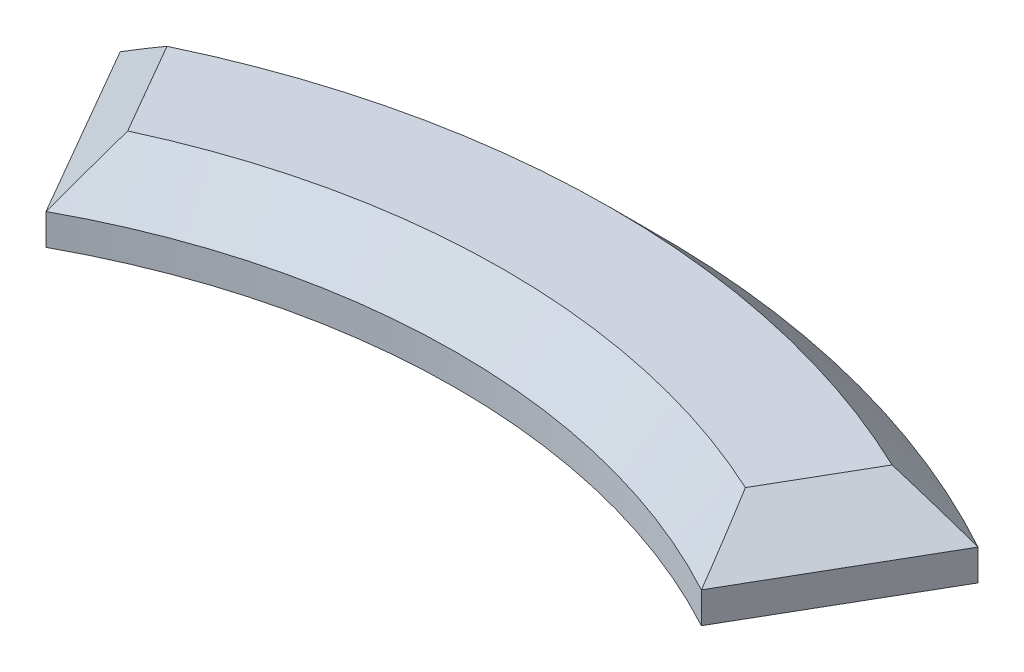
ISO-10303-21;
HEADER;
FILE_DESCRIPTION(('STEP AP214'),'2;1');
FILE_NAME('part.step','',(''),(''),'','','');
FILE_SCHEMA(('AUTOMOTIVE_DESIGN { 1 0 10303 214 1 1 1 1 }'));
ENDSEC;
DATA;
#1=APPLICATION_CONTEXT('core data for automotive mechanical design processes');
#2=APPLICATION_PROTOCOL_DEFINITION('international standard','automotive_design',2000,#1);
#3=PRODUCT_CONTEXT('',#1,'mechanical');
#4=PRODUCT('Part','Part','',(#3));
#5=PRODUCT_RELATED_PRODUCT_CATEGORY('part','',(#4));
#6=PRODUCT_DEFINITION_FORMATION('','',#4);
#7=PRODUCT_DEFINITION_CONTEXT('part definition',#1,'design');
#8=PRODUCT_DEFINITION('design','',#6,#7);
#9=PRODUCT_DEFINITION_SHAPE('','',#8);
#10=(LENGTH_UNIT() NAMED_UNIT(*) SI_UNIT(.MILLI.,.METRE.));
#11=(NAMED_UNIT(*) PLANE_ANGLE_UNIT() SI_UNIT($,.RADIAN.));
#12=(NAMED_UNIT(*) SI_UNIT($,.STERADIAN.) SOLID_ANGLE_UNIT());
#13=UNCERTAINTY_MEASURE_WITH_UNIT(LENGTH_MEASURE(1.E-05),#10,'distance_accuracy_value','');
#14=(GEOMETRIC_REPRESENTATION_CONTEXT(3) GLOBAL_UNCERTAINTY_ASSIGNED_CONTEXT((#13)) GLOBAL_UNIT_ASSIGNED_CONTEXT((#10,
#11,#12)) REPRESENTATION_CONTEXT('',''));
#15=CARTESIAN_POINT('',(0.,0.,0.));
#16=DIRECTION('',(0.,0.,1.));
#17=DIRECTION('',(1.,0.,0.));
#18=AXIS2_PLACEMENT_3D('',#15,#16,#17);
#19=CARTESIAN_POINT('',(0.,3.3,0.));
#20=DIRECTION('',(0.,-1.,0.));
#21=DIRECTION('',(0.,0.,-1.));
#22=AXIS2_PLACEMENT_3D('',#19,#20,#21);
#23=CYLINDRICAL_SURFACE('',#22,37.25);
#24=DIRECTION('',(0.,-1.,0.));
#25=VECTOR('',#24,1.);
#26=CARTESIAN_POINT('',(-17.9717053966979,3.3,-32.6279068457402));
#27=LINE('',#26,#25);
#28=CARTESIAN_POINT('',(-17.9717053966979,1.29999999999999,-32.6279068457402));
#29=VERTEX_POINT('',#28);
#30=CARTESIAN_POINT('',(-17.9717053966979,0.,-32.6279068457402));
#31=VERTEX_POINT('',#30);
#32=EDGE_CURVE('E96',#29,#31,#27,.T.);
#33=ORIENTED_EDGE('',*,*,#32,.F.);
#34=CARTESIAN_POINT('',(0.,1.29999999999999,0.));
#35=DIRECTION('',(0.,-1.,0.));
#36=DIRECTION('',(0.,0.,-1.));
#37=AXIS2_PLACEMENT_3D('',#34,#35,#36);
#38=CIRCLE('',#37,37.25);
#39=CARTESIAN_POINT('',(17.9717053966978,1.29999999999999,-32.6279068457403));
#40=VERTEX_POINT('',#39);
#41=EDGE_CURVE('E143',#29,#40,#38,.T.);
#42=ORIENTED_EDGE('',*,*,#41,.T.);
#43=DIRECTION('',(0.,-1.,0.));
#44=VECTOR('',#43,1.);
#45=CARTESIAN_POINT('',(17.9717053966978,3.3,-32.6279068457403));
#46=LINE('',#45,#44);
#47=CARTESIAN_POINT('',(17.9717053966978,0.,-32.6279068457403));
#48=VERTEX_POINT('',#47);
#49=EDGE_CURVE('E116',#40,#48,#46,.T.);
#50=ORIENTED_EDGE('',*,*,#49,.T.);
#51=CARTESIAN_POINT('',(0.,0.,0.));
#52=DIRECTION('',(0.,1.,0.));
#53=DIRECTION('',(0.,0.,-1.));
#54=AXIS2_PLACEMENT_3D('',#51,#52,#53);
#55=CIRCLE('',#54,37.25);
#56=EDGE_CURVE('E111',#48,#31,#55,.T.);
#57=ORIENTED_EDGE('',*,*,#56,.T.);
#58=EDGE_LOOP('',(#33,#42,#50,#57));
#59=FACE_BOUND('',#58,.T.);
#60=ADVANCED_FACE('F39',(#59),#23,.T.);
#61=CARTESIAN_POINT('',(-17.9717053966979,3.3,-32.6279068457402));
#62=DIRECTION('',(0.866025403784436,0.,-0.500000000000004));
#63=DIRECTION('',(-0.500000000000004,0.,-0.866025403784436));
#64=AXIS2_PLACEMENT_3D('',#61,#62,#63);
#65=PLANE('',#64);
#66=DIRECTION('',(0.,-1.,0.));
#67=VECTOR('',#66,1.);
#68=CARTESIAN_POINT('',(-13.7292564976257,3.3,-25.2797698040326));
#69=LINE('',#68,#67);
#70=CARTESIAN_POINT('',(-13.7292564976257,1.29999999999999,-25.2797698040326));
#71=VERTEX_POINT('',#70);
#72=CARTESIAN_POINT('',(-13.7292564976257,0.,-25.2797698040326));
#73=VERTEX_POINT('',#72);
#74=EDGE_CURVE('E105',#71,#73,#69,.T.);
#75=ORIENTED_EDGE('',*,*,#74,.F.);
#76=DIRECTION('',(-0.500000000000004,0.,-0.866025403784436));
#77=VECTOR('',#76,1.);
#78=CARTESIAN_POINT('',(-17.9717053966979,1.29999999999999,-32.6279068457402));
#79=LINE('',#78,#77);
#80=EDGE_CURVE('E11',#71,#29,#79,.T.);
#81=ORIENTED_EDGE('',*,*,#80,.T.);
#82=ORIENTED_EDGE('',*,*,#32,.T.);
#83=DIRECTION('',(0.500000000000004,0.,0.866025403784436));
#84=VECTOR('',#83,1.);
#85=CARTESIAN_POINT('',(-17.9717053966979,0.,-32.6279068457402));
#86=LINE('',#85,#84);
#87=EDGE_CURVE('E99',#31,#73,#86,.T.);
#88=ORIENTED_EDGE('',*,*,#87,.T.);
#89=EDGE_LOOP('',(#75,#81,#82,#88));
#90=FACE_BOUND('',#89,.T.);
#91=ADVANCED_FACE('F98',(#90),#65,.F.);
#92=CARTESIAN_POINT('',(0.,3.3,0.));
#93=DIRECTION('',(0.,-1.,0.));
#94=DIRECTION('',(0.,0.,-1.));
#95=AXIS2_PLACEMENT_3D('',#92,#93,#94);
#96=CYLINDRICAL_SURFACE('',#95,28.7673294784635);
#97=DIRECTION('',(0.,-1.,0.));
#98=VECTOR('',#97,1.);
#99=CARTESIAN_POINT('',(13.7292564976256,3.3,-25.2797698040326));
#100=LINE('',#99,#98);
#101=CARTESIAN_POINT('',(13.7292564976256,1.29999999999999,-25.2797698040326));
#102=VERTEX_POINT('',#101);
#103=CARTESIAN_POINT('',(13.7292564976256,0.,-25.2797698040326));
#104=VERTEX_POINT('',#103);
#105=EDGE_CURVE('E129',#102,#104,#100,.T.);
#106=ORIENTED_EDGE('',*,*,#105,.F.);
#107=CARTESIAN_POINT('',(0.,1.29999999999999,0.));
#108=DIRECTION('',(0.,-1.,0.));
#109=DIRECTION('',(0.,0.,-1.));
#110=AXIS2_PLACEMENT_3D('',#107,#108,#109);
#111=CIRCLE('',#110,28.7673294784635);
#112=EDGE_CURVE('E54',#102,#71,#111,.F.);
#113=ORIENTED_EDGE('',*,*,#112,.T.);
#114=ORIENTED_EDGE('',*,*,#74,.T.);
#115=CARTESIAN_POINT('',(0.,0.,0.));
#116=DIRECTION('',(0.,-1.,0.));
#117=DIRECTION('',(0.,0.,-1.));
#118=AXIS2_PLACEMENT_3D('',#115,#116,#117);
#119=CIRCLE('',#118,28.7673294784635);
#120=EDGE_CURVE('E113',#73,#104,#119,.T.);
#121=ORIENTED_EDGE('',*,*,#120,.T.);
#122=EDGE_LOOP('',(#106,#113,#114,#121));
#123=FACE_BOUND('',#122,.T.);
#124=ADVANCED_FACE('F191',(#123),#96,.F.);
#125=CARTESIAN_POINT('',(17.9717053966978,3.3,-32.6279068457403));
#126=DIRECTION('',(-0.866025403784441,0.,-0.499999999999996));
#127=DIRECTION('',(-0.499999999999996,0.,0.866025403784441));
#128=AXIS2_PLACEMENT_3D('',#125,#126,#127);
#129=PLANE('',#128);
#130=ORIENTED_EDGE('',*,*,#49,.F.);
#131=DIRECTION('',(-0.499999999999996,0.,0.866025403784441));
#132=VECTOR('',#131,1.);
#133=CARTESIAN_POINT('',(17.9717053966978,1.29999999999998,-32.6279068457403));
#134=LINE('',#133,#132);
#135=EDGE_CURVE('E140',#40,#102,#134,.T.);
#136=ORIENTED_EDGE('',*,*,#135,.T.);
#137=ORIENTED_EDGE('',*,*,#105,.T.);
#138=DIRECTION('',(0.499999999999996,0.,-0.866025403784441));
#139=VECTOR('',#138,1.);
#140=CARTESIAN_POINT('',(17.9717053966978,0.,-32.6279068457403));
#141=LINE('',#140,#139);
#142=EDGE_CURVE('E126',#104,#48,#141,.T.);
#143=ORIENTED_EDGE('',*,*,#142,.T.);
#144=EDGE_LOOP('',(#130,#136,#137,#143));
#145=FACE_BOUND('',#144,.T.);
#146=ADVANCED_FACE('F196',(#145),#129,.F.);
#147=CARTESIAN_POINT('',(0.,3.3,0.));
#148=DIRECTION('',(0.,-1.,0.));
#149=DIRECTION('',(0.,0.,-1.));
#150=AXIS2_PLACEMENT_3D('',#147,#148,#149);
#151=PLANE('',#150);
#152=CARTESIAN_POINT('',(0.,3.3,0.));
#153=DIRECTION('',(0.,-1.,0.));
#154=DIRECTION('',(0.,0.,-1.));
#155=AXIS2_PLACEMENT_3D('',#152,#153,#154);
#156=CIRCLE('',#155,30.7673294784635);
#157=CARTESIAN_POINT('',(-12.9405225492177,3.3,-27.9136425317356));
#158=VERTEX_POINT('',#157);
#159=CARTESIAN_POINT('',(12.9405225492177,3.3,-27.9136425317356));
#160=VERTEX_POINT('',#159);
#161=EDGE_CURVE('E133',#158,#160,#156,.T.);
#162=ORIENTED_EDGE('',*,*,#161,.T.);
#163=DIRECTION('',(0.499999999999996,0.,-0.866025403784441));
#164=VECTOR('',#163,1.);
#165=CARTESIAN_POINT('',(-2.38156986040703,3.3,-1.37499999999988));
#166=LINE('',#165,#164);
#167=CARTESIAN_POINT('',(15.1897135303984,3.3,-31.8093555870664));
#168=VERTEX_POINT('',#167);
#169=EDGE_CURVE('E137',#160,#168,#166,.T.);
#170=ORIENTED_EDGE('',*,*,#169,.T.);
#171=CARTESIAN_POINT('',(0.,3.3,0.));
#172=DIRECTION('',(0.,-1.,0.));
#173=DIRECTION('',(0.,0.,-1.));
#174=AXIS2_PLACEMENT_3D('',#171,#172,#173);
#175=CIRCLE('',#174,35.25);
#176=CARTESIAN_POINT('',(-15.1897135303985,3.3,-31.8093555870663));
#177=VERTEX_POINT('',#176);
#178=EDGE_CURVE('E135',#168,#177,#175,.F.);
#179=ORIENTED_EDGE('',*,*,#178,.T.);
#180=DIRECTION('',(0.500000000000004,0.,0.866025403784436));
#181=VECTOR('',#180,1.);
#182=CARTESIAN_POINT('',(2.38156986040721,3.3,-1.37500000000002));
#183=LINE('',#182,#181);
#184=EDGE_CURVE('E104',#177,#158,#183,.T.);
#185=ORIENTED_EDGE('',*,*,#184,.T.);
#186=EDGE_LOOP('',(#162,#170,#179,#185));
#187=FACE_BOUND('',#186,.T.);
#188=ADVANCED_FACE('F199',(#187),#151,.F.);
#189=CARTESIAN_POINT('',(0.,0.,0.));
#190=DIRECTION('',(0.,-1.,0.));
#191=DIRECTION('',(0.,0.,-1.));
#192=AXIS2_PLACEMENT_3D('',#189,#190,#191);
#193=PLANE('',#192);
#194=CARTESIAN_POINT('',(0.,0.,-33.0086647392318));
#195=DIRECTION('',(0.,-1.,0.));
#196=DIRECTION('',(0.,0.,-1.));
#197=AXIS2_PLACEMENT_3D('',#194,#195,#196);
#198=CIRCLE('',#197,1.625);
#199=CARTESIAN_POINT('',(0.,0.,-34.6336647392318));
#200=VERTEX_POINT('',#199);
#201=EDGE_CURVE('E122',#200,#200,#198,.T.);
#202=ORIENTED_EDGE('',*,*,#201,.F.);
#203=EDGE_LOOP('',(#202));
#204=FACE_BOUND('',#203,.T.);
#205=ORIENTED_EDGE('',*,*,#56,.F.);
#206=ORIENTED_EDGE('',*,*,#142,.F.);
#207=ORIENTED_EDGE('',*,*,#120,.F.);
#208=ORIENTED_EDGE('',*,*,#87,.F.);
#209=EDGE_LOOP('',(#205,#206,#207,#208));
#210=FACE_BOUND('',#209,.T.);
#211=ADVANCED_FACE('F109',(#204,#210),#193,.T.);
#212=CARTESIAN_POINT('',(2.38156986040721,3.3,-1.37500000000001));
#213=DIRECTION('',(0.612372435695794,-0.707106781186546,-0.353553390593277));
#214=DIRECTION('',(0.500000000000004,0.,0.866025403784436));
#215=AXIS2_PLACEMENT_3D('',#212,#213,#214);
#216=PLANE('',#215);
#217=CARTESIAN_POINT('',(-15.1897135303985,3.3,-31.8093555870663));
#218=CARTESIAN_POINT('',(-15.4216878938742,3.13509072973067,-31.8813284301211));
#219=CARTESIAN_POINT('',(-15.6536347059954,2.96971899291436,-31.9523286197359));
#220=CARTESIAN_POINT('',(-16.1174523157781,2.63809193351257,-32.0924301665211));
#221=CARTESIAN_POINT('',(-16.3493231165641,2.47183665389067,-32.1615316150304));
#222=CARTESIAN_POINT('',(-16.8129893780407,2.13846851191168,-32.2978888537055));
#223=CARTESIAN_POINT('',(-17.0447848389801,1.97135565241664,-32.3651446500262));
#224=CARTESIAN_POINT('',(-17.5083039138073,1.63629462423174,-32.4978611815345));
#225=CARTESIAN_POINT('',(-17.7400275236946,1.46834641567572,-32.5633218300604));
#226=CARTESIAN_POINT('',(-17.9717053966979,1.30000000000001,-32.6279068457402));
#227=B_SPLINE_CURVE_WITH_KNOTS('',3,(#217,#218,#219,#220,#221,#222,#223,#224,#225,#226),
.UNSPECIFIED.,.F.,.F.,(4,2,2,2,4),(0.,0.88072739988136,1.76141235796858,2.64209437880263,
3.52281884043465),.UNSPECIFIED.);
#228=EDGE_CURVE('E120',#29,#177,#227,.F.);
#229=ORIENTED_EDGE('',*,*,#228,.F.);
#230=ORIENTED_EDGE('',*,*,#80,.F.);
#231=CARTESIAN_POINT('',(-13.7292564976257,1.29999999999999,-25.2797698040326));
#232=CARTESIAN_POINT('',(-13.6667411530638,1.46499269978006,-25.5014754505589));
#233=CARTESIAN_POINT('',(-13.6033842609293,1.63042982020634,-25.7226123352248));
#234=CARTESIAN_POINT('',(-13.4750482535146,1.96214652350382,-26.163761256537));
#235=CARTESIAN_POINT('',(-13.4100692255866,2.12842606062811,-26.3837733529878));
#236=CARTESIAN_POINT('',(-13.2785433835113,2.46179820854269,-26.8227082078342));
#237=CARTESIAN_POINT('',(-13.2119965764155,2.62889081567334,-27.0416309711241));
#238=CARTESIAN_POINT('',(-13.0773844098668,2.96386466508265,-27.4784235581635));
#239=CARTESIAN_POINT('',(-13.0093189690059,3.13174594925657,-27.6962933247007));
#240=CARTESIAN_POINT('',(-12.9405225492177,3.3,-27.9136425317356));
#241=B_SPLINE_CURVE_WITH_KNOTS('',3,(#231,#232,#233,#234,#235,#236,#237,#238,#239,#240),
.UNSPECIFIED.,.F.,.F.,(4,2,2,2,4),(0.,0.85003075792919,1.70001583992871,2.54999709965071,
3.40002403358744),.UNSPECIFIED.);
#242=EDGE_CURVE('E45',#158,#71,#241,.F.);
#243=ORIENTED_EDGE('',*,*,#242,.F.);
#244=ORIENTED_EDGE('',*,*,#184,.F.);
#245=EDGE_LOOP('',(#229,#230,#243,#244));
#246=FACE_BOUND('',#245,.T.);
#247=ADVANCED_FACE('F42',(#246),#216,.F.);
#248=CARTESIAN_POINT('',(0.,3.3,0.));
#249=DIRECTION('',(0.,1.,0.));
#250=DIRECTION('',(0.,0.,1.));
#251=AXIS2_PLACEMENT_3D('',#248,#249,#250);
#252=CONICAL_SURFACE('',#251,30.7673294784635,0.785398163397447);
#253=ORIENTED_EDGE('',*,*,#242,.T.);
#254=ORIENTED_EDGE('',*,*,#112,.F.);
#255=CARTESIAN_POINT('',(13.7292564976256,1.29999999999999,-25.2797698040326));
#256=CARTESIAN_POINT('',(13.6667411530637,1.46499269978006,-25.5014754505589));
#257=CARTESIAN_POINT('',(13.6033842609293,1.63042982020634,-25.7226123352249));
#258=CARTESIAN_POINT('',(13.4750482535146,1.96214652350383,-26.163761256537));
#259=CARTESIAN_POINT('',(13.4100692255865,2.12842606062811,-26.3837733529878));
#260=CARTESIAN_POINT('',(13.2785433835112,2.46179820854269,-26.8227082078343));
#261=CARTESIAN_POINT('',(13.2119965764154,2.62889081567334,-27.0416309711241));
#262=CARTESIAN_POINT('',(13.0773844098668,2.96386466508265,-27.4784235581636));
#263=CARTESIAN_POINT('',(13.0093189690059,3.13174594925657,-27.6962933247008));
#264=CARTESIAN_POINT('',(12.9405225492177,3.3,-27.9136425317356));
#265=B_SPLINE_CURVE_WITH_KNOTS('',3,(#255,#256,#257,#258,#259,#260,#261,#262,#263,#264),
.UNSPECIFIED.,.F.,.F.,(4,2,2,2,4),(0.,0.850030757929189,1.70001583992871,2.54999709965071,
3.40002403358745),.UNSPECIFIED.);
#266=EDGE_CURVE('E154',#160,#102,#265,.F.);
#267=ORIENTED_EDGE('',*,*,#266,.F.);
#268=ORIENTED_EDGE('',*,*,#161,.F.);
#269=EDGE_LOOP('',(#253,#254,#267,#268));
#270=FACE_BOUND('',#269,.T.);
#271=ADVANCED_FACE('F173',(#270),#252,.F.);
#272=CARTESIAN_POINT('',(0.,3.3,0.));
#273=DIRECTION('',(0.,-1.,0.));
#274=DIRECTION('',(0.,0.,-1.));
#275=AXIS2_PLACEMENT_3D('',#272,#273,#274);
#276=CONICAL_SURFACE('',#275,35.25,0.785398163397446);
#277=ORIENTED_EDGE('',*,*,#228,.T.);
#278=ORIENTED_EDGE('',*,*,#178,.F.);
#279=CARTESIAN_POINT('',(15.1897135303984,3.3,-31.8093555870664));
#280=CARTESIAN_POINT('',(15.4216878938741,3.13509072973067,-31.8813284301212));
#281=CARTESIAN_POINT('',(15.6536347059952,2.96971899291436,-31.9523286197359));
#282=CARTESIAN_POINT('',(16.1174523157779,2.63809193351258,-32.0924301665211));
#283=CARTESIAN_POINT('',(16.349323116564,2.47183665389067,-32.1615316150304));
#284=CARTESIAN_POINT('',(16.8129893780406,2.13846851191167,-32.2978888537055));
#285=CARTESIAN_POINT('',(17.0447848389799,1.97135565241664,-32.3651446500262));
#286=CARTESIAN_POINT('',(17.5083039138072,1.63629462423174,-32.4978611815345));
#287=CARTESIAN_POINT('',(17.7400275236944,1.46834641567572,-32.5633218300605));
#288=CARTESIAN_POINT('',(17.9717053966978,1.3,-32.6279068457403));
#289=B_SPLINE_CURVE_WITH_KNOTS('',3,(#279,#280,#281,#282,#283,#284,#285,#286,#287,#288),
.UNSPECIFIED.,.F.,.F.,(4,2,2,2,4),(0.,0.880727399881354,1.76141235796858,2.64209437880262,
3.52281884043465),.UNSPECIFIED.);
#290=EDGE_CURVE('E146',#40,#168,#289,.F.);
#291=ORIENTED_EDGE('',*,*,#290,.F.);
#292=ORIENTED_EDGE('',*,*,#41,.F.);
#293=EDGE_LOOP('',(#277,#278,#291,#292));
#294=FACE_BOUND('',#293,.T.);
#295=ADVANCED_FACE('F161',(#294),#276,.T.);
#296=CARTESIAN_POINT('',(-2.38156986040703,3.3,-1.37499999999988));
#297=DIRECTION('',(-0.612372435695797,-0.707106781186546,-0.353553390593271));
#298=DIRECTION('',(0.499999999999996,0.,-0.866025403784441));
#299=AXIS2_PLACEMENT_3D('',#296,#297,#298);
#300=PLANE('',#299);
#301=ORIENTED_EDGE('',*,*,#266,.T.);
#302=ORIENTED_EDGE('',*,*,#135,.F.);
#303=ORIENTED_EDGE('',*,*,#290,.T.);
#304=ORIENTED_EDGE('',*,*,#169,.F.);
#305=EDGE_LOOP('',(#301,#302,#303,#304));
#306=FACE_BOUND('',#305,.T.);
#307=ADVANCED_FACE('F165',(#306),#300,.F.);
#308=CARTESIAN_POINT('',(0.,2.,-33.0086647392318));
#309=DIRECTION('',(0.,-1.,0.));
#310=DIRECTION('',(0.,0.,-1.));
#311=AXIS2_PLACEMENT_3D('',#308,#309,#310);
#312=CYLINDRICAL_SURFACE('',#311,1.625);
#313=CARTESIAN_POINT('',(0.,2.,-33.0086647392318));
#314=DIRECTION('',(0.,-1.,0.));
#315=DIRECTION('',(0.,0.,-1.));
#316=AXIS2_PLACEMENT_3D('',#313,#314,#315);
#317=CIRCLE('',#316,1.625);
#318=CARTESIAN_POINT('',(0.,2.,-34.6336647392318));
#319=VERTEX_POINT('',#318);
#320=EDGE_CURVE('E155',#319,#319,#317,.T.);
#321=ORIENTED_EDGE('',*,*,#320,.F.);
#322=EDGE_LOOP('',(#321));
#323=FACE_BOUND('',#322,.T.);
#324=ORIENTED_EDGE('',*,*,#201,.T.);
#325=EDGE_LOOP('',(#324));
#326=FACE_BOUND('',#325,.T.);
#327=ADVANCED_FACE('F171',(#323,#326),#312,.F.);
#328=CARTESIAN_POINT('',(0.,2.,-33.0086647392318));
#329=DIRECTION('',(0.,-1.,0.));
#330=DIRECTION('',(0.,0.,-1.));
#331=AXIS2_PLACEMENT_3D('',#328,#329,#330);
#332=PLANE('',#331);
#333=ORIENTED_EDGE('',*,*,#320,.T.);
#334=EDGE_LOOP('',(#333));
#335=FACE_BOUND('',#334,.T.);
#336=ADVANCED_FACE('F209',(#335),#332,.T.);
#337=CLOSED_SHELL('',(#60,#91,#124,#146,#188,#211,#247,#271,#295,#307,#327,#336));
#338=MANIFOLD_SOLID_BREP('B2',#337);
#339=ADVANCED_BREP_SHAPE_REPRESENTATION('',(#18,#338),#14);
#340=SHAPE_DEFINITION_REPRESENTATION(#9,#339);
ENDSEC;
END-ISO-10303-21;
